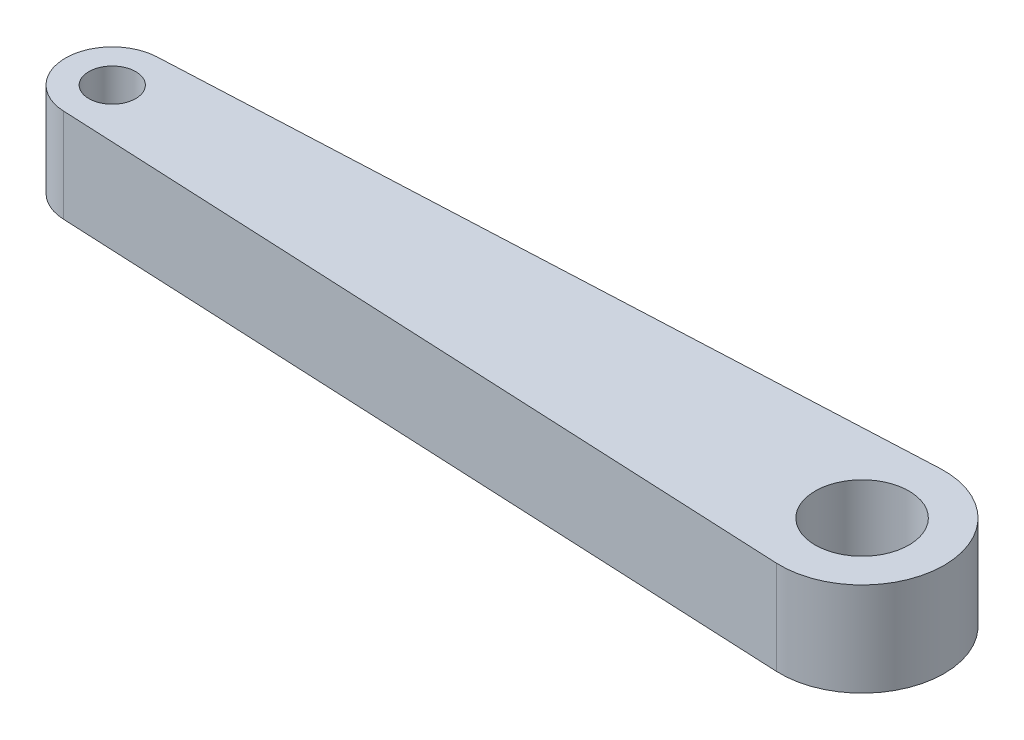
ISO-10303-21;
HEADER;
FILE_DESCRIPTION(('STEP AP214'),'2;1');
FILE_NAME('part.step','',(''),(''),'','','');
FILE_SCHEMA(('AUTOMOTIVE_DESIGN { 1 0 10303 214 1 1 1 1 }'));
ENDSEC;
DATA;
#1=APPLICATION_CONTEXT('core data for automotive mechanical design processes');
#2=APPLICATION_PROTOCOL_DEFINITION('international standard','automotive_design',2000,#1);
#3=PRODUCT_CONTEXT('',#1,'mechanical');
#4=PRODUCT('Part','Part','',(#3));
#5=PRODUCT_RELATED_PRODUCT_CATEGORY('part','',(#4));
#6=PRODUCT_DEFINITION_FORMATION('','',#4);
#7=PRODUCT_DEFINITION_CONTEXT('part definition',#1,'design');
#8=PRODUCT_DEFINITION('design','',#6,#7);
#9=PRODUCT_DEFINITION_SHAPE('','',#8);
#10=(LENGTH_UNIT() NAMED_UNIT(*) SI_UNIT(.MILLI.,.METRE.));
#11=(NAMED_UNIT(*) PLANE_ANGLE_UNIT() SI_UNIT($,.RADIAN.));
#12=(NAMED_UNIT(*) SI_UNIT($,.STERADIAN.) SOLID_ANGLE_UNIT());
#13=UNCERTAINTY_MEASURE_WITH_UNIT(LENGTH_MEASURE(1.E-05),#10,'distance_accuracy_value','');
#14=(GEOMETRIC_REPRESENTATION_CONTEXT(3) GLOBAL_UNCERTAINTY_ASSIGNED_CONTEXT((#13)) GLOBAL_UNIT_ASSIGNED_CONTEXT((#10,
#11,#12)) REPRESENTATION_CONTEXT('',''));
#15=CARTESIAN_POINT('',(0.,0.,0.));
#16=DIRECTION('',(0.,0.,1.));
#17=DIRECTION('',(1.,0.,0.));
#18=AXIS2_PLACEMENT_3D('',#15,#16,#17);
#19=CARTESIAN_POINT('',(32.,4.,0.));
#20=DIRECTION('',(0.,1.,0.));
#21=DIRECTION('',(0.,0.,1.));
#22=AXIS2_PLACEMENT_3D('',#19,#20,#21);
#23=PLANE('',#22);
#24=CARTESIAN_POINT('',(0.,4.,0.));
#25=DIRECTION('',(0.,1.,0.));
#26=DIRECTION('',(0.,0.,1.));
#27=AXIS2_PLACEMENT_3D('',#24,#25,#26);
#28=CIRCLE('',#27,1.);
#29=CARTESIAN_POINT('',(0.,4.,1.));
#30=VERTEX_POINT('',#29);
#31=EDGE_CURVE('E108',#30,#30,#28,.T.);
#32=ORIENTED_EDGE('',*,*,#31,.F.);
#33=EDGE_LOOP('',(#32));
#34=FACE_BOUND('',#33,.T.);
#35=CARTESIAN_POINT('',(32.,4.,0.));
#36=DIRECTION('',(0.,1.,0.));
#37=DIRECTION('',(0.,0.,1.));
#38=AXIS2_PLACEMENT_3D('',#35,#36,#37);
#39=CIRCLE('',#38,3.5);
#40=CARTESIAN_POINT('',(31.8359375,4.,3.49615267059288));
#41=VERTEX_POINT('',#40);
#42=CARTESIAN_POINT('',(31.8359375,4.,-3.49615267059288));
#43=VERTEX_POINT('',#42);
#44=EDGE_CURVE('E93',#41,#43,#39,.T.);
#45=ORIENTED_EDGE('',*,*,#44,.T.);
#46=DIRECTION('',(-0.998900763026538,0.,0.046875));
#47=VECTOR('',#46,1.);
#48=CARTESIAN_POINT('',(-0.09375,4.,-1.99780152605308));
#49=LINE('',#48,#47);
#50=CARTESIAN_POINT('',(-0.09375,4.,-1.99780152605308));
#51=VERTEX_POINT('',#50);
#52=EDGE_CURVE('E88',#43,#51,#49,.T.);
#53=ORIENTED_EDGE('',*,*,#52,.T.);
#54=CARTESIAN_POINT('',(0.,4.,0.));
#55=DIRECTION('',(0.,1.,0.));
#56=DIRECTION('',(0.,0.,1.));
#57=AXIS2_PLACEMENT_3D('',#54,#55,#56);
#58=CIRCLE('',#57,2.);
#59=CARTESIAN_POINT('',(-0.0937499999999999,4.,1.99780152605308));
#60=VERTEX_POINT('',#59);
#61=EDGE_CURVE('E91',#51,#60,#58,.T.);
#62=ORIENTED_EDGE('',*,*,#61,.T.);
#63=DIRECTION('',(0.998900763026538,0.,0.046875));
#64=VECTOR('',#63,1.);
#65=CARTESIAN_POINT('',(-0.09375,4.,1.99780152605308));
#66=LINE('',#65,#64);
#67=EDGE_CURVE('E58',#60,#41,#66,.T.);
#68=ORIENTED_EDGE('',*,*,#67,.T.);
#69=EDGE_LOOP('',(#45,#53,#62,#68));
#70=FACE_BOUND('',#69,.T.);
#71=CARTESIAN_POINT('',(32.,4.,0.));
#72=DIRECTION('',(0.,1.,0.));
#73=DIRECTION('',(0.,0.,1.));
#74=AXIS2_PLACEMENT_3D('',#71,#72,#73);
#75=CIRCLE('',#74,2.);
#76=CARTESIAN_POINT('',(32.,4.,2.));
#77=VERTEX_POINT('',#76);
#78=EDGE_CURVE('E123',#77,#77,#75,.T.);
#79=ORIENTED_EDGE('',*,*,#78,.F.);
#80=EDGE_LOOP('',(#79));
#81=FACE_BOUND('',#80,.T.);
#82=ADVANCED_FACE('F41',(#34,#70,#81),#23,.T.);
#83=CARTESIAN_POINT('',(32.,0.,0.));
#84=DIRECTION('',(0.,1.,0.));
#85=DIRECTION('',(0.,0.,1.));
#86=AXIS2_PLACEMENT_3D('',#83,#84,#85);
#87=PLANE('',#86);
#88=CARTESIAN_POINT('',(32.,0.,0.));
#89=DIRECTION('',(0.,1.,0.));
#90=DIRECTION('',(0.,0.,1.));
#91=AXIS2_PLACEMENT_3D('',#88,#89,#90);
#92=CIRCLE('',#91,3.5);
#93=CARTESIAN_POINT('',(31.8359375,0.,3.49615267059288));
#94=VERTEX_POINT('',#93);
#95=CARTESIAN_POINT('',(31.8359375,0.,-3.49615267059288));
#96=VERTEX_POINT('',#95);
#97=EDGE_CURVE('E105',#94,#96,#92,.T.);
#98=ORIENTED_EDGE('',*,*,#97,.F.);
#99=DIRECTION('',(0.998900763026538,0.,0.046875));
#100=VECTOR('',#99,1.);
#101=CARTESIAN_POINT('',(-0.09375,0.,1.99780152605308));
#102=LINE('',#101,#100);
#103=CARTESIAN_POINT('',(-0.0937499999999999,0.,1.99780152605308));
#104=VERTEX_POINT('',#103);
#105=EDGE_CURVE('E81',#104,#94,#102,.T.);
#106=ORIENTED_EDGE('',*,*,#105,.F.);
#107=CARTESIAN_POINT('',(0.,0.,0.));
#108=DIRECTION('',(0.,1.,0.));
#109=DIRECTION('',(0.,0.,1.));
#110=AXIS2_PLACEMENT_3D('',#107,#108,#109);
#111=CIRCLE('',#110,2.);
#112=CARTESIAN_POINT('',(-0.09375,0.,-1.99780152605308));
#113=VERTEX_POINT('',#112);
#114=EDGE_CURVE('E75',#113,#104,#111,.T.);
#115=ORIENTED_EDGE('',*,*,#114,.F.);
#116=DIRECTION('',(-0.998900763026538,0.,0.046875));
#117=VECTOR('',#116,1.);
#118=CARTESIAN_POINT('',(-0.09375,0.,-1.99780152605308));
#119=LINE('',#118,#117);
#120=EDGE_CURVE('E97',#96,#113,#119,.T.);
#121=ORIENTED_EDGE('',*,*,#120,.F.);
#122=EDGE_LOOP('',(#98,#106,#115,#121));
#123=FACE_BOUND('',#122,.T.);
#124=CARTESIAN_POINT('',(0.,0.,0.));
#125=DIRECTION('',(0.,1.,0.));
#126=DIRECTION('',(0.,0.,1.));
#127=AXIS2_PLACEMENT_3D('',#124,#125,#126);
#128=CIRCLE('',#127,1.);
#129=CARTESIAN_POINT('',(0.,0.,1.));
#130=VERTEX_POINT('',#129);
#131=EDGE_CURVE('E120',#130,#130,#128,.T.);
#132=ORIENTED_EDGE('',*,*,#131,.T.);
#133=EDGE_LOOP('',(#132));
#134=FACE_BOUND('',#133,.T.);
#135=CARTESIAN_POINT('',(32.,0.,0.));
#136=DIRECTION('',(0.,1.,0.));
#137=DIRECTION('',(0.,0.,1.));
#138=AXIS2_PLACEMENT_3D('',#135,#136,#137);
#139=CIRCLE('',#138,2.);
#140=CARTESIAN_POINT('',(32.,0.,2.));
#141=VERTEX_POINT('',#140);
#142=EDGE_CURVE('E126',#141,#141,#139,.T.);
#143=ORIENTED_EDGE('',*,*,#142,.T.);
#144=EDGE_LOOP('',(#143));
#145=FACE_BOUND('',#144,.T.);
#146=ADVANCED_FACE('F116',(#123,#134,#145),#87,.F.);
#147=CARTESIAN_POINT('',(32.,4.,0.));
#148=DIRECTION('',(0.,-1.,0.));
#149=DIRECTION('',(0.,0.,-1.));
#150=AXIS2_PLACEMENT_3D('',#147,#148,#149);
#151=CYLINDRICAL_SURFACE('',#150,3.5);
#152=ORIENTED_EDGE('',*,*,#97,.T.);
#153=DIRECTION('',(0.,-1.,0.));
#154=VECTOR('',#153,1.);
#155=CARTESIAN_POINT('',(31.8359375,4.,-3.49615267059288));
#156=LINE('',#155,#154);
#157=EDGE_CURVE('E11',#43,#96,#156,.T.);
#158=ORIENTED_EDGE('',*,*,#157,.F.);
#159=ORIENTED_EDGE('',*,*,#44,.F.);
#160=DIRECTION('',(0.,-1.,0.));
#161=VECTOR('',#160,1.);
#162=CARTESIAN_POINT('',(31.8359375,4.,3.49615267059288));
#163=LINE('',#162,#161);
#164=EDGE_CURVE('E101',#41,#94,#163,.T.);
#165=ORIENTED_EDGE('',*,*,#164,.T.);
#166=EDGE_LOOP('',(#152,#158,#159,#165));
#167=FACE_BOUND('',#166,.T.);
#168=ADVANCED_FACE('F43',(#167),#151,.T.);
#169=CARTESIAN_POINT('',(-0.09375,4.,-1.99780152605308));
#170=DIRECTION('',(0.046875,0.,0.998900763026538));
#171=DIRECTION('',(0.998900763026538,0.,-0.046875));
#172=AXIS2_PLACEMENT_3D('',#169,#170,#171);
#173=PLANE('',#172);
#174=ORIENTED_EDGE('',*,*,#120,.T.);
#175=DIRECTION('',(0.,-1.,0.));
#176=VECTOR('',#175,1.);
#177=CARTESIAN_POINT('',(-0.09375,4.,-1.99780152605308));
#178=LINE('',#177,#176);
#179=EDGE_CURVE('E50',#51,#113,#178,.T.);
#180=ORIENTED_EDGE('',*,*,#179,.F.);
#181=ORIENTED_EDGE('',*,*,#52,.F.);
#182=ORIENTED_EDGE('',*,*,#157,.T.);
#183=EDGE_LOOP('',(#174,#180,#181,#182));
#184=FACE_BOUND('',#183,.T.);
#185=ADVANCED_FACE('F96',(#184),#173,.F.);
#186=CARTESIAN_POINT('',(0.,4.,0.));
#187=DIRECTION('',(0.,-1.,0.));
#188=DIRECTION('',(0.,0.,-1.));
#189=AXIS2_PLACEMENT_3D('',#186,#187,#188);
#190=CYLINDRICAL_SURFACE('',#189,2.);
#191=ORIENTED_EDGE('',*,*,#114,.T.);
#192=DIRECTION('',(0.,-1.,0.));
#193=VECTOR('',#192,1.);
#194=CARTESIAN_POINT('',(-0.0937499999999999,4.,1.99780152605308));
#195=LINE('',#194,#193);
#196=EDGE_CURVE('E98',#60,#104,#195,.T.);
#197=ORIENTED_EDGE('',*,*,#196,.F.);
#198=ORIENTED_EDGE('',*,*,#61,.F.);
#199=ORIENTED_EDGE('',*,*,#179,.T.);
#200=EDGE_LOOP('',(#191,#197,#198,#199));
#201=FACE_BOUND('',#200,.T.);
#202=ADVANCED_FACE('F99',(#201),#190,.T.);
#203=CARTESIAN_POINT('',(-0.09375,4.,1.99780152605308));
#204=DIRECTION('',(0.046875,0.,-0.998900763026538));
#205=DIRECTION('',(-0.998900763026538,0.,-0.046875));
#206=AXIS2_PLACEMENT_3D('',#203,#204,#205);
#207=PLANE('',#206);
#208=ORIENTED_EDGE('',*,*,#105,.T.);
#209=ORIENTED_EDGE('',*,*,#164,.F.);
#210=ORIENTED_EDGE('',*,*,#67,.F.);
#211=ORIENTED_EDGE('',*,*,#196,.T.);
#212=EDGE_LOOP('',(#208,#209,#210,#211));
#213=FACE_BOUND('',#212,.T.);
#214=ADVANCED_FACE('F113',(#213),#207,.F.);
#215=CARTESIAN_POINT('',(0.,4.,0.));
#216=DIRECTION('',(0.,-1.,0.));
#217=DIRECTION('',(0.,0.,-1.));
#218=AXIS2_PLACEMENT_3D('',#215,#216,#217);
#219=CYLINDRICAL_SURFACE('',#218,1.);
#220=ORIENTED_EDGE('',*,*,#31,.T.);
#221=EDGE_LOOP('',(#220));
#222=FACE_BOUND('',#221,.T.);
#223=ORIENTED_EDGE('',*,*,#131,.F.);
#224=EDGE_LOOP('',(#223));
#225=FACE_BOUND('',#224,.T.);
#226=ADVANCED_FACE('F143',(#222,#225),#219,.F.);
#227=CARTESIAN_POINT('',(32.,4.,0.));
#228=DIRECTION('',(0.,-1.,0.));
#229=DIRECTION('',(0.,0.,-1.));
#230=AXIS2_PLACEMENT_3D('',#227,#228,#229);
#231=CYLINDRICAL_SURFACE('',#230,2.);
#232=ORIENTED_EDGE('',*,*,#78,.T.);
#233=EDGE_LOOP('',(#232));
#234=FACE_BOUND('',#233,.T.);
#235=ORIENTED_EDGE('',*,*,#142,.F.);
#236=EDGE_LOOP('',(#235));
#237=FACE_BOUND('',#236,.T.);
#238=ADVANCED_FACE('F132',(#234,#237),#231,.F.);
#239=CLOSED_SHELL('',(#82,#146,#168,#185,#202,#214,#226,#238));
#240=MANIFOLD_SOLID_BREP('B2',#239);
#241=ADVANCED_BREP_SHAPE_REPRESENTATION('',(#18,#240),#14);
#242=SHAPE_DEFINITION_REPRESENTATION(#9,#241);
ENDSEC;
END-ISO-10303-21;
